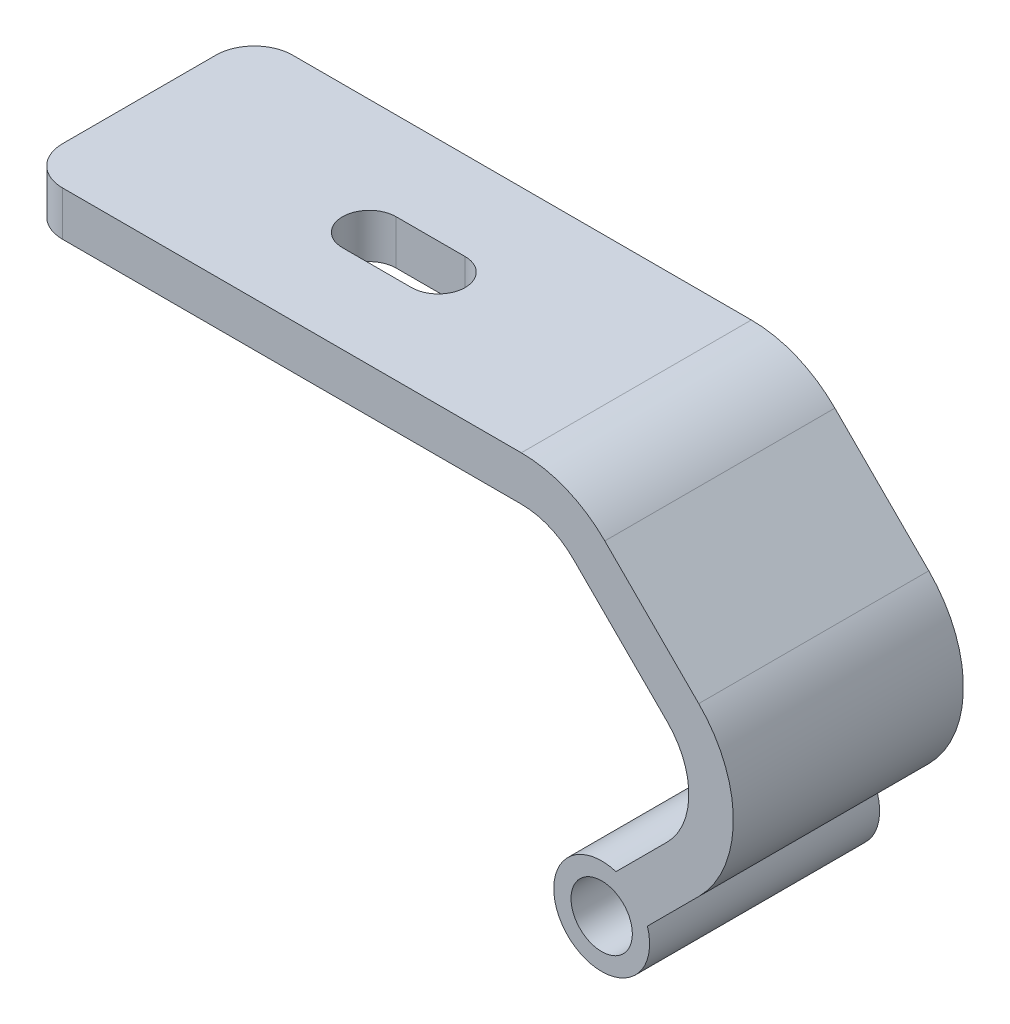
ISO-10303-21;
HEADER;
FILE_DESCRIPTION(('STEP AP214'),'2;1');
FILE_NAME('part.step','',(''),(''),'','','');
FILE_SCHEMA(('AUTOMOTIVE_DESIGN { 1 0 10303 214 1 1 1 1 }'));
ENDSEC;
DATA;
#1=APPLICATION_CONTEXT('core data for automotive mechanical design processes');
#2=APPLICATION_PROTOCOL_DEFINITION('international standard','automotive_design',2000,#1);
#3=PRODUCT_CONTEXT('',#1,'mechanical');
#4=PRODUCT('Part','Part','',(#3));
#5=PRODUCT_RELATED_PRODUCT_CATEGORY('part','',(#4));
#6=PRODUCT_DEFINITION_FORMATION('','',#4);
#7=PRODUCT_DEFINITION_CONTEXT('part definition',#1,'design');
#8=PRODUCT_DEFINITION('design','',#6,#7);
#9=PRODUCT_DEFINITION_SHAPE('','',#8);
#10=(LENGTH_UNIT() NAMED_UNIT(*) SI_UNIT(.MILLI.,.METRE.));
#11=(NAMED_UNIT(*) PLANE_ANGLE_UNIT() SI_UNIT($,.RADIAN.));
#12=(NAMED_UNIT(*) SI_UNIT($,.STERADIAN.) SOLID_ANGLE_UNIT());
#13=UNCERTAINTY_MEASURE_WITH_UNIT(LENGTH_MEASURE(1.E-05),#10,'distance_accuracy_value','');
#14=(GEOMETRIC_REPRESENTATION_CONTEXT(3) GLOBAL_UNCERTAINTY_ASSIGNED_CONTEXT((#13)) GLOBAL_UNIT_ASSIGNED_CONTEXT((#10,
#11,#12)) REPRESENTATION_CONTEXT('',''));
#15=CARTESIAN_POINT('',(0.,0.,0.));
#16=DIRECTION('',(0.,0.,1.));
#17=DIRECTION('',(1.,0.,0.));
#18=AXIS2_PLACEMENT_3D('',#15,#16,#17);
#19=CARTESIAN_POINT('',(32.4111652351682,-12.5,15.));
#20=DIRECTION('',(0.,0.,-1.));
#21=DIRECTION('',(-1.,0.,0.));
#22=AXIS2_PLACEMENT_3D('',#19,#20,#21);
#23=PLANE('',#22);
#24=DIRECTION('',(-1.,0.,0.));
#25=VECTOR('',#24,1.);
#26=CARTESIAN_POINT('',(-32.4111652351682,2.9,15.));
#27=LINE('',#26,#25);
#28=CARTESIAN_POINT('',(32.4111652351682,2.9,15.));
#29=VERTEX_POINT('',#28);
#30=CARTESIAN_POINT('',(-27.4111652351681,2.9,15.));
#31=VERTEX_POINT('',#30);
#32=EDGE_CURVE('E234',#29,#31,#27,.T.);
#33=ORIENTED_EDGE('',*,*,#32,.T.);
#34=DIRECTION('',(0.,-1.,0.));
#35=VECTOR('',#34,1.);
#36=CARTESIAN_POINT('',(-27.4111652351681,-12.5,15.));
#37=LINE('',#36,#35);
#38=CARTESIAN_POINT('',(-27.4111652351681,-2.9,15.));
#39=VERTEX_POINT('',#38);
#40=EDGE_CURVE('E11',#31,#39,#37,.T.);
#41=ORIENTED_EDGE('',*,*,#40,.T.);
#42=DIRECTION('',(1.,0.,0.));
#43=VECTOR('',#42,1.);
#44=CARTESIAN_POINT('',(-32.4111652351682,-2.9,15.));
#45=LINE('',#44,#43);
#46=CARTESIAN_POINT('',(32.4111652351682,-2.9,15.));
#47=VERTEX_POINT('',#46);
#48=EDGE_CURVE('E213',#39,#47,#45,.T.);
#49=ORIENTED_EDGE('',*,*,#48,.T.);
#50=CARTESIAN_POINT('',(32.4111652351682,-12.5,15.));
#51=DIRECTION('',(0.,0.,-1.));
#52=DIRECTION('',(-1.,0.,0.));
#53=AXIS2_PLACEMENT_3D('',#50,#51,#52);
#54=CIRCLE('',#53,9.6);
#55=CARTESIAN_POINT('',(39.199390334559,-5.71177490060914,15.));
#56=VERTEX_POINT('',#55);
#57=EDGE_CURVE('E215',#47,#56,#54,.T.);
#58=ORIENTED_EDGE('',*,*,#57,.T.);
#59=DIRECTION('',(0.707106781186548,-0.707106781186547,0.));
#60=VECTOR('',#59,1.);
#61=CARTESIAN_POINT('',(39.199390334559,-5.71177490060915,15.));
#62=LINE('',#61,#60);
#63=CARTESIAN_POINT('',(51.4481276760882,-17.9605122421383,15.));
#64=VERTEX_POINT('',#63);
#65=EDGE_CURVE('E218',#56,#64,#62,.T.);
#66=ORIENTED_EDGE('',*,*,#65,.T.);
#67=CARTESIAN_POINT('',(44.6599025766973,-24.7487373415292,15.));
#68=DIRECTION('',(0.,0.,-1.));
#69=DIRECTION('',(-1.,0.,0.));
#70=AXIS2_PLACEMENT_3D('',#67,#68,#69);
#71=CIRCLE('',#70,9.6);
#72=CARTESIAN_POINT('',(51.4481276760882,-31.53696244092,15.));
#73=VERTEX_POINT('',#72);
#74=EDGE_CURVE('E220',#64,#73,#71,.T.);
#75=ORIENTED_EDGE('',*,*,#74,.T.);
#76=DIRECTION('',(-0.707106781186547,-0.707106781186547,0.));
#77=VECTOR('',#76,1.);
#78=CARTESIAN_POINT('',(51.4481276760882,-31.53696244092,15.));
#79=LINE('',#78,#77);
#80=CARTESIAN_POINT('',(44.7564014352368,-38.2286886817714,15.));
#81=VERTEX_POINT('',#80);
#82=EDGE_CURVE('E222',#73,#81,#79,.T.);
#83=ORIENTED_EDGE('',*,*,#82,.T.);
#84=CARTESIAN_POINT('',(42.892135623731,-44.1941738241592,15.));
#85=DIRECTION('',(0.,0.,1.));
#86=DIRECTION('',(1.,0.,0.));
#87=AXIS2_PLACEMENT_3D('',#84,#85,#86);
#88=CIRCLE('',#87,6.25);
#89=CARTESIAN_POINT('',(48.8576207661188,-42.3299080126533,15.));
#90=VERTEX_POINT('',#89);
#91=EDGE_CURVE('E224',#81,#90,#88,.T.);
#92=ORIENTED_EDGE('',*,*,#91,.T.);
#93=DIRECTION('',(0.707106781186547,0.707106781186548,0.));
#94=VECTOR('',#93,1.);
#95=CARTESIAN_POINT('',(55.5493470069702,-35.638181771802,15.));
#96=LINE('',#95,#94);
#97=CARTESIAN_POINT('',(55.5493470069702,-35.638181771802,15.));
#98=VERTEX_POINT('',#97);
#99=EDGE_CURVE('E226',#90,#98,#96,.T.);
#100=ORIENTED_EDGE('',*,*,#99,.T.);
#101=CARTESIAN_POINT('',(44.6599025766973,-24.7487373415292,15.));
#102=DIRECTION('',(0.,0.,1.));
#103=DIRECTION('',(-1.,0.,0.));
#104=AXIS2_PLACEMENT_3D('',#101,#102,#103);
#105=CIRCLE('',#104,15.4);
#106=CARTESIAN_POINT('',(55.5493470069702,-13.8592929112563,15.));
#107=VERTEX_POINT('',#106);
#108=EDGE_CURVE('E228',#98,#107,#105,.T.);
#109=ORIENTED_EDGE('',*,*,#108,.T.);
#110=DIRECTION('',(-0.707106781186548,0.707106781186547,0.));
#111=VECTOR('',#110,1.);
#112=CARTESIAN_POINT('',(43.300609665441,-1.61055556972717,15.));
#113=LINE('',#112,#111);
#114=CARTESIAN_POINT('',(43.300609665441,-1.61055556972717,15.));
#115=VERTEX_POINT('',#114);
#116=EDGE_CURVE('E230',#107,#115,#113,.T.);
#117=ORIENTED_EDGE('',*,*,#116,.T.);
#118=CARTESIAN_POINT('',(32.4111652351682,-12.5,15.));
#119=DIRECTION('',(0.,0.,1.));
#120=DIRECTION('',(-1.,0.,0.));
#121=AXIS2_PLACEMENT_3D('',#118,#119,#120);
#122=CIRCLE('',#121,15.4);
#123=EDGE_CURVE('E232',#115,#29,#122,.T.);
#124=ORIENTED_EDGE('',*,*,#123,.T.);
#125=EDGE_LOOP('',(#33,#41,#49,#58,#66,#75,#83,#92,#100,#109,#117,#124));
#126=FACE_BOUND('',#125,.T.);
#127=CARTESIAN_POINT('',(42.892135623731,-44.1941738241592,15.));
#128=DIRECTION('',(0.,0.,1.));
#129=DIRECTION('',(1.,0.,0.));
#130=AXIS2_PLACEMENT_3D('',#127,#128,#129);
#131=CIRCLE('',#130,4.);
#132=CARTESIAN_POINT('',(46.892135623731,-44.1941738241592,15.));
#133=VERTEX_POINT('',#132);
#134=EDGE_CURVE('E207',#133,#133,#131,.T.);
#135=ORIENTED_EDGE('',*,*,#134,.F.);
#136=EDGE_LOOP('',(#135));
#137=FACE_BOUND('',#136,.T.);
#138=ADVANCED_FACE('F34',(#126,#137),#23,.F.);
#139=CARTESIAN_POINT('',(32.4111652351682,-12.5,-15.));
#140=DIRECTION('',(0.,0.,-1.));
#141=DIRECTION('',(-1.,0.,0.));
#142=AXIS2_PLACEMENT_3D('',#139,#140,#141);
#143=PLANE('',#142);
#144=DIRECTION('',(1.,0.,0.));
#145=VECTOR('',#144,1.);
#146=CARTESIAN_POINT('',(-32.4111652351682,-2.9,-15.));
#147=LINE('',#146,#145);
#148=CARTESIAN_POINT('',(-27.4111652351682,-2.9,-15.));
#149=VERTEX_POINT('',#148);
#150=CARTESIAN_POINT('',(32.4111652351682,-2.9,-15.));
#151=VERTEX_POINT('',#150);
#152=EDGE_CURVE('E210',#149,#151,#147,.T.);
#153=ORIENTED_EDGE('',*,*,#152,.F.);
#154=DIRECTION('',(0.,-1.,0.));
#155=VECTOR('',#154,1.);
#156=CARTESIAN_POINT('',(-27.4111652351682,2.9,-15.));
#157=LINE('',#156,#155);
#158=CARTESIAN_POINT('',(-27.4111652351682,2.9,-15.));
#159=VERTEX_POINT('',#158);
#160=EDGE_CURVE('E57',#149,#159,#157,.F.);
#161=ORIENTED_EDGE('',*,*,#160,.T.);
#162=DIRECTION('',(-1.,0.,0.));
#163=VECTOR('',#162,1.);
#164=CARTESIAN_POINT('',(-32.4111652351682,2.9,-15.));
#165=LINE('',#164,#163);
#166=CARTESIAN_POINT('',(32.4111652351682,2.9,-15.));
#167=VERTEX_POINT('',#166);
#168=EDGE_CURVE('E216',#167,#159,#165,.T.);
#169=ORIENTED_EDGE('',*,*,#168,.F.);
#170=CARTESIAN_POINT('',(32.4111652351682,-12.5,-15.));
#171=DIRECTION('',(0.,0.,1.));
#172=DIRECTION('',(-1.,0.,0.));
#173=AXIS2_PLACEMENT_3D('',#170,#171,#172);
#174=CIRCLE('',#173,15.4);
#175=CARTESIAN_POINT('',(43.300609665441,-1.61055556972717,-15.));
#176=VERTEX_POINT('',#175);
#177=EDGE_CURVE('E254',#176,#167,#174,.T.);
#178=ORIENTED_EDGE('',*,*,#177,.F.);
#179=DIRECTION('',(-0.707106781186548,0.707106781186547,0.));
#180=VECTOR('',#179,1.);
#181=CARTESIAN_POINT('',(43.300609665441,-1.61055556972717,-15.));
#182=LINE('',#181,#180);
#183=CARTESIAN_POINT('',(55.5493470069702,-13.8592929112563,-15.));
#184=VERTEX_POINT('',#183);
#185=EDGE_CURVE('E252',#184,#176,#182,.T.);
#186=ORIENTED_EDGE('',*,*,#185,.F.);
#187=CARTESIAN_POINT('',(44.6599025766973,-24.7487373415292,-15.));
#188=DIRECTION('',(0.,0.,1.));
#189=DIRECTION('',(-1.,0.,0.));
#190=AXIS2_PLACEMENT_3D('',#187,#188,#189);
#191=CIRCLE('',#190,15.4);
#192=CARTESIAN_POINT('',(55.5493470069702,-35.638181771802,-15.));
#193=VERTEX_POINT('',#192);
#194=EDGE_CURVE('E250',#193,#184,#191,.T.);
#195=ORIENTED_EDGE('',*,*,#194,.F.);
#196=DIRECTION('',(0.707106781186547,0.707106781186548,0.));
#197=VECTOR('',#196,1.);
#198=CARTESIAN_POINT('',(55.5493470069702,-35.638181771802,-15.));
#199=LINE('',#198,#197);
#200=CARTESIAN_POINT('',(48.8576207661188,-42.3299080126533,-15.));
#201=VERTEX_POINT('',#200);
#202=EDGE_CURVE('E248',#201,#193,#199,.T.);
#203=ORIENTED_EDGE('',*,*,#202,.F.);
#204=CARTESIAN_POINT('',(42.892135623731,-44.1941738241592,-15.));
#205=DIRECTION('',(0.,0.,1.));
#206=DIRECTION('',(1.,0.,0.));
#207=AXIS2_PLACEMENT_3D('',#204,#205,#206);
#208=CIRCLE('',#207,6.25);
#209=CARTESIAN_POINT('',(44.7564014352368,-38.2286886817714,-15.));
#210=VERTEX_POINT('',#209);
#211=EDGE_CURVE('E246',#210,#201,#208,.T.);
#212=ORIENTED_EDGE('',*,*,#211,.F.);
#213=DIRECTION('',(-0.707106781186547,-0.707106781186547,0.));
#214=VECTOR('',#213,1.);
#215=CARTESIAN_POINT('',(51.4481276760882,-31.53696244092,-15.));
#216=LINE('',#215,#214);
#217=CARTESIAN_POINT('',(51.4481276760882,-31.53696244092,-15.));
#218=VERTEX_POINT('',#217);
#219=EDGE_CURVE('E244',#218,#210,#216,.T.);
#220=ORIENTED_EDGE('',*,*,#219,.F.);
#221=CARTESIAN_POINT('',(44.6599025766973,-24.7487373415292,-15.));
#222=DIRECTION('',(0.,0.,-1.));
#223=DIRECTION('',(-1.,0.,0.));
#224=AXIS2_PLACEMENT_3D('',#221,#222,#223);
#225=CIRCLE('',#224,9.6);
#226=CARTESIAN_POINT('',(51.4481276760882,-17.9605122421383,-15.));
#227=VERTEX_POINT('',#226);
#228=EDGE_CURVE('E242',#227,#218,#225,.T.);
#229=ORIENTED_EDGE('',*,*,#228,.F.);
#230=DIRECTION('',(0.707106781186548,-0.707106781186547,0.));
#231=VECTOR('',#230,1.);
#232=CARTESIAN_POINT('',(39.199390334559,-5.71177490060915,-15.));
#233=LINE('',#232,#231);
#234=CARTESIAN_POINT('',(39.199390334559,-5.71177490060914,-15.));
#235=VERTEX_POINT('',#234);
#236=EDGE_CURVE('E240',#235,#227,#233,.T.);
#237=ORIENTED_EDGE('',*,*,#236,.F.);
#238=CARTESIAN_POINT('',(32.4111652351682,-12.5,-15.));
#239=DIRECTION('',(0.,0.,-1.));
#240=DIRECTION('',(-1.,0.,0.));
#241=AXIS2_PLACEMENT_3D('',#238,#239,#240);
#242=CIRCLE('',#241,9.6);
#243=EDGE_CURVE('E238',#151,#235,#242,.T.);
#244=ORIENTED_EDGE('',*,*,#243,.F.);
#245=EDGE_LOOP('',(#153,#161,#169,#178,#186,#195,#203,#212,#220,#229,#237,#244));
#246=FACE_BOUND('',#245,.T.);
#247=CARTESIAN_POINT('',(42.892135623731,-44.1941738241592,-15.));
#248=DIRECTION('',(0.,0.,1.));
#249=DIRECTION('',(1.,0.,0.));
#250=AXIS2_PLACEMENT_3D('',#247,#248,#249);
#251=CIRCLE('',#250,4.);
#252=CARTESIAN_POINT('',(46.892135623731,-44.1941738241592,-15.));
#253=VERTEX_POINT('',#252);
#254=EDGE_CURVE('E183',#253,#253,#251,.T.);
#255=ORIENTED_EDGE('',*,*,#254,.T.);
#256=EDGE_LOOP('',(#255));
#257=FACE_BOUND('',#256,.T.);
#258=ADVANCED_FACE('F313',(#246,#257),#143,.T.);
#259=CARTESIAN_POINT('',(-32.4111652351682,-2.9,15.));
#260=DIRECTION('',(1.,0.,0.));
#261=DIRECTION('',(0.,0.,-1.));
#262=AXIS2_PLACEMENT_3D('',#259,#260,#261);
#263=PLANE('',#262);
#264=DIRECTION('',(0.,0.,-1.));
#265=VECTOR('',#264,1.);
#266=CARTESIAN_POINT('',(-32.4111652351682,2.9,15.));
#267=LINE('',#266,#265);
#268=CARTESIAN_POINT('',(-32.4111652351682,2.9,10.));
#269=VERTEX_POINT('',#268);
#270=CARTESIAN_POINT('',(-32.4111652351682,2.9,-10.));
#271=VERTEX_POINT('',#270);
#272=EDGE_CURVE('E236',#269,#271,#267,.T.);
#273=ORIENTED_EDGE('',*,*,#272,.T.);
#274=DIRECTION('',(0.,-1.,0.));
#275=VECTOR('',#274,1.);
#276=CARTESIAN_POINT('',(-32.4111652351682,-2.9,-10.));
#277=LINE('',#276,#275);
#278=CARTESIAN_POINT('',(-32.4111652351682,-2.9,-10.));
#279=VERTEX_POINT('',#278);
#280=EDGE_CURVE('E294',#271,#279,#277,.T.);
#281=ORIENTED_EDGE('',*,*,#280,.T.);
#282=DIRECTION('',(0.,0.,-1.));
#283=VECTOR('',#282,1.);
#284=CARTESIAN_POINT('',(-32.4111652351682,-2.9,15.));
#285=LINE('',#284,#283);
#286=CARTESIAN_POINT('',(-32.4111652351682,-2.9,10.));
#287=VERTEX_POINT('',#286);
#288=EDGE_CURVE('E289',#287,#279,#285,.T.);
#289=ORIENTED_EDGE('',*,*,#288,.F.);
#290=DIRECTION('',(0.,-1.,0.));
#291=VECTOR('',#290,1.);
#292=CARTESIAN_POINT('',(-32.4111652351682,-2.9,10.));
#293=LINE('',#292,#291);
#294=EDGE_CURVE('E292',#287,#269,#293,.F.);
#295=ORIENTED_EDGE('',*,*,#294,.T.);
#296=EDGE_LOOP('',(#273,#281,#289,#295));
#297=FACE_BOUND('',#296,.T.);
#298=ADVANCED_FACE('F307',(#297),#263,.F.);
#299=CARTESIAN_POINT('',(-32.4111652351682,-2.9,15.));
#300=DIRECTION('',(0.,1.,0.));
#301=DIRECTION('',(0.,0.,1.));
#302=AXIS2_PLACEMENT_3D('',#299,#300,#301);
#303=PLANE('',#302);
#304=DIRECTION('',(1.,0.,0.));
#305=VECTOR('',#304,1.);
#306=CARTESIAN_POINT('',(-2.41116523516816,-2.9,-3.5));
#307=LINE('',#306,#305);
#308=CARTESIAN_POINT('',(-2.41116523516816,-2.9,-3.5));
#309=VERTEX_POINT('',#308);
#310=CARTESIAN_POINT('',(6.58883476483184,-2.9,-3.5));
#311=VERTEX_POINT('',#310);
#312=EDGE_CURVE('E189',#309,#311,#307,.T.);
#313=ORIENTED_EDGE('',*,*,#312,.F.);
#314=CARTESIAN_POINT('',(-2.41116523516816,-2.9,0.));
#315=DIRECTION('',(0.,1.,0.));
#316=DIRECTION('',(0.,0.,1.));
#317=AXIS2_PLACEMENT_3D('',#314,#315,#316);
#318=CIRCLE('',#317,3.5);
#319=CARTESIAN_POINT('',(-2.41116523516816,-2.9,3.5));
#320=VERTEX_POINT('',#319);
#321=EDGE_CURVE('E167',#320,#309,#318,.F.);
#322=ORIENTED_EDGE('',*,*,#321,.F.);
#323=DIRECTION('',(-1.,0.,0.));
#324=VECTOR('',#323,1.);
#325=CARTESIAN_POINT('',(-2.41116523516816,-2.9,3.5));
#326=LINE('',#325,#324);
#327=CARTESIAN_POINT('',(6.58883476483184,-2.9,3.5));
#328=VERTEX_POINT('',#327);
#329=EDGE_CURVE('E179',#328,#320,#326,.T.);
#330=ORIENTED_EDGE('',*,*,#329,.F.);
#331=CARTESIAN_POINT('',(6.58883476483184,-2.9,0.));
#332=DIRECTION('',(0.,1.,0.));
#333=DIRECTION('',(0.,0.,1.));
#334=AXIS2_PLACEMENT_3D('',#331,#332,#333);
#335=CIRCLE('',#334,3.5);
#336=EDGE_CURVE('E193',#311,#328,#335,.F.);
#337=ORIENTED_EDGE('',*,*,#336,.F.);
#338=EDGE_LOOP('',(#313,#322,#330,#337));
#339=FACE_BOUND('',#338,.T.);
#340=ORIENTED_EDGE('',*,*,#288,.T.);
#341=CARTESIAN_POINT('',(-27.4111652351682,-2.9,-10.));
#342=DIRECTION('',(0.,1.,0.));
#343=DIRECTION('',(0.,0.,1.));
#344=AXIS2_PLACEMENT_3D('',#341,#342,#343);
#345=CIRCLE('',#344,5.);
#346=EDGE_CURVE('E299',#279,#149,#345,.F.);
#347=ORIENTED_EDGE('',*,*,#346,.T.);
#348=ORIENTED_EDGE('',*,*,#152,.T.);
#349=DIRECTION('',(0.,0.,-1.));
#350=VECTOR('',#349,1.);
#351=CARTESIAN_POINT('',(32.4111652351682,-2.9,15.));
#352=LINE('',#351,#350);
#353=EDGE_CURVE('E286',#47,#151,#352,.T.);
#354=ORIENTED_EDGE('',*,*,#353,.F.);
#355=ORIENTED_EDGE('',*,*,#48,.F.);
#356=CARTESIAN_POINT('',(-27.4111652351681,-2.9,10.));
#357=DIRECTION('',(0.,1.,0.));
#358=DIRECTION('',(0.,0.,1.));
#359=AXIS2_PLACEMENT_3D('',#356,#357,#358);
#360=CIRCLE('',#359,5.);
#361=EDGE_CURVE('E297',#39,#287,#360,.F.);
#362=ORIENTED_EDGE('',*,*,#361,.T.);
#363=EDGE_LOOP('',(#340,#347,#348,#354,#355,#362));
#364=FACE_BOUND('',#363,.T.);
#365=ADVANCED_FACE('F186',(#339,#364),#303,.F.);
#366=CARTESIAN_POINT('',(32.4111652351682,-12.5,15.));
#367=DIRECTION('',(0.,0.,-1.));
#368=DIRECTION('',(-1.,0.,0.));
#369=AXIS2_PLACEMENT_3D('',#366,#367,#368);
#370=CYLINDRICAL_SURFACE('',#369,9.6);
#371=ORIENTED_EDGE('',*,*,#243,.T.);
#372=DIRECTION('',(0.,0.,-1.));
#373=VECTOR('',#372,1.);
#374=CARTESIAN_POINT('',(39.199390334559,-5.71177490060914,15.));
#375=LINE('',#374,#373);
#376=EDGE_CURVE('E283',#56,#235,#375,.T.);
#377=ORIENTED_EDGE('',*,*,#376,.F.);
#378=ORIENTED_EDGE('',*,*,#57,.F.);
#379=ORIENTED_EDGE('',*,*,#353,.T.);
#380=EDGE_LOOP('',(#371,#377,#378,#379));
#381=FACE_BOUND('',#380,.T.);
#382=ADVANCED_FACE('F319',(#381),#370,.F.);
#383=CARTESIAN_POINT('',(39.199390334559,-5.71177490060915,15.));
#384=DIRECTION('',(0.707106781186547,0.707106781186548,0.));
#385=DIRECTION('',(-0.707106781186548,0.707106781186547,0.));
#386=AXIS2_PLACEMENT_3D('',#383,#384,#385);
#387=PLANE('',#386);
#388=ORIENTED_EDGE('',*,*,#236,.T.);
#389=DIRECTION('',(0.,0.,-1.));
#390=VECTOR('',#389,1.);
#391=CARTESIAN_POINT('',(51.4481276760882,-17.9605122421383,15.));
#392=LINE('',#391,#390);
#393=EDGE_CURVE('E280',#64,#227,#392,.T.);
#394=ORIENTED_EDGE('',*,*,#393,.F.);
#395=ORIENTED_EDGE('',*,*,#65,.F.);
#396=ORIENTED_EDGE('',*,*,#376,.T.);
#397=EDGE_LOOP('',(#388,#394,#395,#396));
#398=FACE_BOUND('',#397,.T.);
#399=ADVANCED_FACE('F323',(#398),#387,.F.);
#400=CARTESIAN_POINT('',(44.6599025766973,-24.7487373415292,15.));
#401=DIRECTION('',(0.,0.,-1.));
#402=DIRECTION('',(-1.,0.,0.));
#403=AXIS2_PLACEMENT_3D('',#400,#401,#402);
#404=CYLINDRICAL_SURFACE('',#403,9.6);
#405=ORIENTED_EDGE('',*,*,#228,.T.);
#406=DIRECTION('',(0.,0.,-1.));
#407=VECTOR('',#406,1.);
#408=CARTESIAN_POINT('',(51.4481276760882,-31.53696244092,15.));
#409=LINE('',#408,#407);
#410=EDGE_CURVE('E277',#73,#218,#409,.T.);
#411=ORIENTED_EDGE('',*,*,#410,.F.);
#412=ORIENTED_EDGE('',*,*,#74,.F.);
#413=ORIENTED_EDGE('',*,*,#393,.T.);
#414=EDGE_LOOP('',(#405,#411,#412,#413));
#415=FACE_BOUND('',#414,.T.);
#416=ADVANCED_FACE('F372',(#415),#404,.F.);
#417=CARTESIAN_POINT('',(51.4481276760882,-31.53696244092,15.));
#418=DIRECTION('',(0.707106781186547,-0.707106781186547,0.));
#419=DIRECTION('',(0.707106781186548,0.707106781186548,0.));
#420=AXIS2_PLACEMENT_3D('',#417,#418,#419);
#421=PLANE('',#420);
#422=ORIENTED_EDGE('',*,*,#219,.T.);
#423=DIRECTION('',(0.,0.,-1.));
#424=VECTOR('',#423,1.);
#425=CARTESIAN_POINT('',(44.7564014352368,-38.2286886817714,15.));
#426=LINE('',#425,#424);
#427=EDGE_CURVE('E274',#81,#210,#426,.T.);
#428=ORIENTED_EDGE('',*,*,#427,.F.);
#429=ORIENTED_EDGE('',*,*,#82,.F.);
#430=ORIENTED_EDGE('',*,*,#410,.T.);
#431=EDGE_LOOP('',(#422,#428,#429,#430));
#432=FACE_BOUND('',#431,.T.);
#433=ADVANCED_FACE('F368',(#432),#421,.F.);
#434=CARTESIAN_POINT('',(42.892135623731,-44.1941738241592,15.));
#435=DIRECTION('',(0.,0.,-1.));
#436=DIRECTION('',(-1.,0.,0.));
#437=AXIS2_PLACEMENT_3D('',#434,#435,#436);
#438=CYLINDRICAL_SURFACE('',#437,6.25);
#439=ORIENTED_EDGE('',*,*,#211,.T.);
#440=DIRECTION('',(0.,0.,-1.));
#441=VECTOR('',#440,1.);
#442=CARTESIAN_POINT('',(48.8576207661188,-42.3299080126533,15.));
#443=LINE('',#442,#441);
#444=EDGE_CURVE('E271',#90,#201,#443,.T.);
#445=ORIENTED_EDGE('',*,*,#444,.F.);
#446=ORIENTED_EDGE('',*,*,#91,.F.);
#447=ORIENTED_EDGE('',*,*,#427,.T.);
#448=EDGE_LOOP('',(#439,#445,#446,#447));
#449=FACE_BOUND('',#448,.T.);
#450=ADVANCED_FACE('F364',(#449),#438,.T.);
#451=CARTESIAN_POINT('',(55.5493470069702,-35.638181771802,15.));
#452=DIRECTION('',(-0.707106781186548,0.707106781186547,0.));
#453=DIRECTION('',(-0.707106781186547,-0.707106781186548,0.));
#454=AXIS2_PLACEMENT_3D('',#451,#452,#453);
#455=PLANE('',#454);
#456=ORIENTED_EDGE('',*,*,#202,.T.);
#457=DIRECTION('',(0.,0.,-1.));
#458=VECTOR('',#457,1.);
#459=CARTESIAN_POINT('',(55.5493470069702,-35.638181771802,15.));
#460=LINE('',#459,#458);
#461=EDGE_CURVE('E268',#98,#193,#460,.T.);
#462=ORIENTED_EDGE('',*,*,#461,.F.);
#463=ORIENTED_EDGE('',*,*,#99,.F.);
#464=ORIENTED_EDGE('',*,*,#444,.T.);
#465=EDGE_LOOP('',(#456,#462,#463,#464));
#466=FACE_BOUND('',#465,.T.);
#467=ADVANCED_FACE('F360',(#466),#455,.F.);
#468=CARTESIAN_POINT('',(44.6599025766973,-24.7487373415292,15.));
#469=DIRECTION('',(0.,0.,-1.));
#470=DIRECTION('',(-1.,0.,0.));
#471=AXIS2_PLACEMENT_3D('',#468,#469,#470);
#472=CYLINDRICAL_SURFACE('',#471,15.4);
#473=ORIENTED_EDGE('',*,*,#194,.T.);
#474=DIRECTION('',(0.,0.,-1.));
#475=VECTOR('',#474,1.);
#476=CARTESIAN_POINT('',(55.5493470069702,-13.8592929112563,15.));
#477=LINE('',#476,#475);
#478=EDGE_CURVE('E265',#107,#184,#477,.T.);
#479=ORIENTED_EDGE('',*,*,#478,.F.);
#480=ORIENTED_EDGE('',*,*,#108,.F.);
#481=ORIENTED_EDGE('',*,*,#461,.T.);
#482=EDGE_LOOP('',(#473,#479,#480,#481));
#483=FACE_BOUND('',#482,.T.);
#484=ADVANCED_FACE('F356',(#483),#472,.T.);
#485=CARTESIAN_POINT('',(43.300609665441,-1.61055556972717,15.));
#486=DIRECTION('',(-0.707106781186547,-0.707106781186548,0.));
#487=DIRECTION('',(0.707106781186548,-0.707106781186547,0.));
#488=AXIS2_PLACEMENT_3D('',#485,#486,#487);
#489=PLANE('',#488);
#490=ORIENTED_EDGE('',*,*,#185,.T.);
#491=DIRECTION('',(0.,0.,-1.));
#492=VECTOR('',#491,1.);
#493=CARTESIAN_POINT('',(43.300609665441,-1.61055556972717,15.));
#494=LINE('',#493,#492);
#495=EDGE_CURVE('E262',#115,#176,#494,.T.);
#496=ORIENTED_EDGE('',*,*,#495,.F.);
#497=ORIENTED_EDGE('',*,*,#116,.F.);
#498=ORIENTED_EDGE('',*,*,#478,.T.);
#499=EDGE_LOOP('',(#490,#496,#497,#498));
#500=FACE_BOUND('',#499,.T.);
#501=ADVANCED_FACE('F352',(#500),#489,.F.);
#502=CARTESIAN_POINT('',(32.4111652351682,-12.5,15.));
#503=DIRECTION('',(0.,0.,-1.));
#504=DIRECTION('',(-1.,0.,0.));
#505=AXIS2_PLACEMENT_3D('',#502,#503,#504);
#506=CYLINDRICAL_SURFACE('',#505,15.4);
#507=ORIENTED_EDGE('',*,*,#177,.T.);
#508=DIRECTION('',(0.,0.,-1.));
#509=VECTOR('',#508,1.);
#510=CARTESIAN_POINT('',(32.4111652351682,2.9,15.));
#511=LINE('',#510,#509);
#512=EDGE_CURVE('E259',#29,#167,#511,.T.);
#513=ORIENTED_EDGE('',*,*,#512,.F.);
#514=ORIENTED_EDGE('',*,*,#123,.F.);
#515=ORIENTED_EDGE('',*,*,#495,.T.);
#516=EDGE_LOOP('',(#507,#513,#514,#515));
#517=FACE_BOUND('',#516,.T.);
#518=ADVANCED_FACE('F348',(#517),#506,.T.);
#519=CARTESIAN_POINT('',(-32.4111652351682,2.9,15.));
#520=DIRECTION('',(0.,-1.,0.));
#521=DIRECTION('',(0.,0.,-1.));
#522=AXIS2_PLACEMENT_3D('',#519,#520,#521);
#523=PLANE('',#522);
#524=DIRECTION('',(1.,0.,0.));
#525=VECTOR('',#524,1.);
#526=CARTESIAN_POINT('',(-2.41116523516816,2.9,3.5));
#527=LINE('',#526,#525);
#528=CARTESIAN_POINT('',(-2.41116523516816,2.9,3.5));
#529=VERTEX_POINT('',#528);
#530=CARTESIAN_POINT('',(6.58883476483184,2.9,3.5));
#531=VERTEX_POINT('',#530);
#532=EDGE_CURVE('E191',#529,#531,#527,.T.);
#533=ORIENTED_EDGE('',*,*,#532,.F.);
#534=CARTESIAN_POINT('',(-2.41116523516816,2.9,0.));
#535=DIRECTION('',(0.,1.,0.));
#536=DIRECTION('',(0.,0.,1.));
#537=AXIS2_PLACEMENT_3D('',#534,#535,#536);
#538=CIRCLE('',#537,3.5);
#539=CARTESIAN_POINT('',(-2.41116523516816,2.9,-3.5));
#540=VERTEX_POINT('',#539);
#541=EDGE_CURVE('E170',#540,#529,#538,.T.);
#542=ORIENTED_EDGE('',*,*,#541,.F.);
#543=DIRECTION('',(-1.,0.,0.));
#544=VECTOR('',#543,1.);
#545=CARTESIAN_POINT('',(-2.41116523516816,2.9,-3.5));
#546=LINE('',#545,#544);
#547=CARTESIAN_POINT('',(6.58883476483184,2.9,-3.5));
#548=VERTEX_POINT('',#547);
#549=EDGE_CURVE('E175',#548,#540,#546,.T.);
#550=ORIENTED_EDGE('',*,*,#549,.F.);
#551=CARTESIAN_POINT('',(6.58883476483184,2.9,0.));
#552=DIRECTION('',(0.,1.,0.));
#553=DIRECTION('',(0.,0.,1.));
#554=AXIS2_PLACEMENT_3D('',#551,#552,#553);
#555=CIRCLE('',#554,3.5);
#556=EDGE_CURVE('E198',#531,#548,#555,.T.);
#557=ORIENTED_EDGE('',*,*,#556,.F.);
#558=EDGE_LOOP('',(#533,#542,#550,#557));
#559=FACE_BOUND('',#558,.T.);
#560=ORIENTED_EDGE('',*,*,#168,.T.);
#561=CARTESIAN_POINT('',(-27.4111652351682,2.9,-10.));
#562=DIRECTION('',(0.,-1.,0.));
#563=DIRECTION('',(0.,0.,-1.));
#564=AXIS2_PLACEMENT_3D('',#561,#562,#563);
#565=CIRCLE('',#564,5.);
#566=EDGE_CURVE('E42',#159,#271,#565,.F.);
#567=ORIENTED_EDGE('',*,*,#566,.T.);
#568=ORIENTED_EDGE('',*,*,#272,.F.);
#569=CARTESIAN_POINT('',(-27.4111652351681,2.9,10.));
#570=DIRECTION('',(0.,-1.,0.));
#571=DIRECTION('',(0.,0.,-1.));
#572=AXIS2_PLACEMENT_3D('',#569,#570,#571);
#573=CIRCLE('',#572,5.);
#574=EDGE_CURVE('E49',#269,#31,#573,.F.);
#575=ORIENTED_EDGE('',*,*,#574,.T.);
#576=ORIENTED_EDGE('',*,*,#32,.F.);
#577=ORIENTED_EDGE('',*,*,#512,.T.);
#578=EDGE_LOOP('',(#560,#567,#568,#575,#576,#577));
#579=FACE_BOUND('',#578,.T.);
#580=ADVANCED_FACE('F303',(#559,#579),#523,.F.);
#581=CARTESIAN_POINT('',(42.892135623731,-44.1941738241592,15.));
#582=DIRECTION('',(0.,0.,-1.));
#583=DIRECTION('',(-1.,0.,0.));
#584=AXIS2_PLACEMENT_3D('',#581,#582,#583);
#585=CYLINDRICAL_SURFACE('',#584,4.);
#586=ORIENTED_EDGE('',*,*,#134,.T.);
#587=EDGE_LOOP('',(#586));
#588=FACE_BOUND('',#587,.T.);
#589=ORIENTED_EDGE('',*,*,#254,.F.);
#590=EDGE_LOOP('',(#589));
#591=FACE_BOUND('',#590,.T.);
#592=ADVANCED_FACE('F343',(#588,#591),#585,.F.);
#593=CARTESIAN_POINT('',(-2.41116523516816,-50.4451738241592,0.));
#594=DIRECTION('',(0.,1.,0.));
#595=DIRECTION('',(0.,0.,1.));
#596=AXIS2_PLACEMENT_3D('',#593,#594,#595);
#597=CYLINDRICAL_SURFACE('',#596,3.5);
#598=ORIENTED_EDGE('',*,*,#321,.T.);
#599=DIRECTION('',(0.,1.,0.));
#600=VECTOR('',#599,1.);
#601=CARTESIAN_POINT('',(-2.41116523516816,-50.4451738241592,-3.5));
#602=LINE('',#601,#600);
#603=EDGE_CURVE('E184',#309,#540,#602,.T.);
#604=ORIENTED_EDGE('',*,*,#603,.T.);
#605=ORIENTED_EDGE('',*,*,#541,.T.);
#606=DIRECTION('',(0.,1.,0.));
#607=VECTOR('',#606,1.);
#608=CARTESIAN_POINT('',(-2.41116523516816,-50.4451738241592,3.5));
#609=LINE('',#608,#607);
#610=EDGE_CURVE('E163',#320,#529,#609,.T.);
#611=ORIENTED_EDGE('',*,*,#610,.F.);
#612=EDGE_LOOP('',(#598,#604,#605,#611));
#613=FACE_BOUND('',#612,.T.);
#614=ADVANCED_FACE('F165',(#613),#597,.F.);
#615=CARTESIAN_POINT('',(-2.41116523516816,-50.4451738241592,-3.5));
#616=DIRECTION('',(0.,0.,-1.));
#617=DIRECTION('',(-1.,0.,0.));
#618=AXIS2_PLACEMENT_3D('',#615,#616,#617);
#619=PLANE('',#618);
#620=ORIENTED_EDGE('',*,*,#312,.T.);
#621=DIRECTION('',(0.,1.,0.));
#622=VECTOR('',#621,1.);
#623=CARTESIAN_POINT('',(6.58883476483184,-50.4451738241592,-3.5));
#624=LINE('',#623,#622);
#625=EDGE_CURVE('E204',#311,#548,#624,.T.);
#626=ORIENTED_EDGE('',*,*,#625,.T.);
#627=ORIENTED_EDGE('',*,*,#549,.T.);
#628=ORIENTED_EDGE('',*,*,#603,.F.);
#629=EDGE_LOOP('',(#620,#626,#627,#628));
#630=FACE_BOUND('',#629,.T.);
#631=ADVANCED_FACE('F445',(#630),#619,.F.);
#632=CARTESIAN_POINT('',(6.58883476483184,-50.4451738241592,0.));
#633=DIRECTION('',(0.,1.,0.));
#634=DIRECTION('',(0.,0.,1.));
#635=AXIS2_PLACEMENT_3D('',#632,#633,#634);
#636=CYLINDRICAL_SURFACE('',#635,3.5);
#637=ORIENTED_EDGE('',*,*,#336,.T.);
#638=DIRECTION('',(0.,1.,0.));
#639=VECTOR('',#638,1.);
#640=CARTESIAN_POINT('',(6.58883476483184,-50.4451738241592,3.5));
#641=LINE('',#640,#639);
#642=EDGE_CURVE('E174',#328,#531,#641,.T.);
#643=ORIENTED_EDGE('',*,*,#642,.T.);
#644=ORIENTED_EDGE('',*,*,#556,.T.);
#645=ORIENTED_EDGE('',*,*,#625,.F.);
#646=EDGE_LOOP('',(#637,#643,#644,#645));
#647=FACE_BOUND('',#646,.T.);
#648=ADVANCED_FACE('F451',(#647),#636,.F.);
#649=CARTESIAN_POINT('',(-2.41116523516816,-50.4451738241592,3.5));
#650=DIRECTION('',(0.,0.,1.));
#651=DIRECTION('',(1.,0.,0.));
#652=AXIS2_PLACEMENT_3D('',#649,#650,#651);
#653=PLANE('',#652);
#654=ORIENTED_EDGE('',*,*,#329,.T.);
#655=ORIENTED_EDGE('',*,*,#610,.T.);
#656=ORIENTED_EDGE('',*,*,#532,.T.);
#657=ORIENTED_EDGE('',*,*,#642,.F.);
#658=EDGE_LOOP('',(#654,#655,#656,#657));
#659=FACE_BOUND('',#658,.T.);
#660=ADVANCED_FACE('F180',(#659),#653,.F.);
#661=CARTESIAN_POINT('',(-27.4111652351682,-2.9,-10.));
#662=DIRECTION('',(0.,1.,0.));
#663=DIRECTION('',(0.,0.,1.));
#664=AXIS2_PLACEMENT_3D('',#661,#662,#663);
#665=CYLINDRICAL_SURFACE('',#664,5.);
#666=ORIENTED_EDGE('',*,*,#566,.F.);
#667=ORIENTED_EDGE('',*,*,#160,.F.);
#668=ORIENTED_EDGE('',*,*,#346,.F.);
#669=ORIENTED_EDGE('',*,*,#280,.F.);
#670=EDGE_LOOP('',(#666,#667,#668,#669));
#671=FACE_BOUND('',#670,.T.);
#672=ADVANCED_FACE('F310',(#671),#665,.T.);
#673=CARTESIAN_POINT('',(-27.4111652351681,-12.5,10.));
#674=DIRECTION('',(0.,-1.,0.));
#675=DIRECTION('',(0.,0.,-1.));
#676=AXIS2_PLACEMENT_3D('',#673,#674,#675);
#677=CYLINDRICAL_SURFACE('',#676,5.);
#678=ORIENTED_EDGE('',*,*,#574,.F.);
#679=ORIENTED_EDGE('',*,*,#294,.F.);
#680=ORIENTED_EDGE('',*,*,#361,.F.);
#681=ORIENTED_EDGE('',*,*,#40,.F.);
#682=EDGE_LOOP('',(#678,#679,#680,#681));
#683=FACE_BOUND('',#682,.T.);
#684=ADVANCED_FACE('F36',(#683),#677,.T.);
#685=CLOSED_SHELL('',(#138,#258,#298,#365,#382,#399,#416,#433,#450,#467,#484,#501,#518,#580,
#592,#614,#631,#648,#660,#672,#684));
#686=MANIFOLD_SOLID_BREP('B2',#685);
#687=ADVANCED_BREP_SHAPE_REPRESENTATION('',(#18,#686),#14);
#688=SHAPE_DEFINITION_REPRESENTATION(#9,#687);
ENDSEC;
END-ISO-10303-21;
